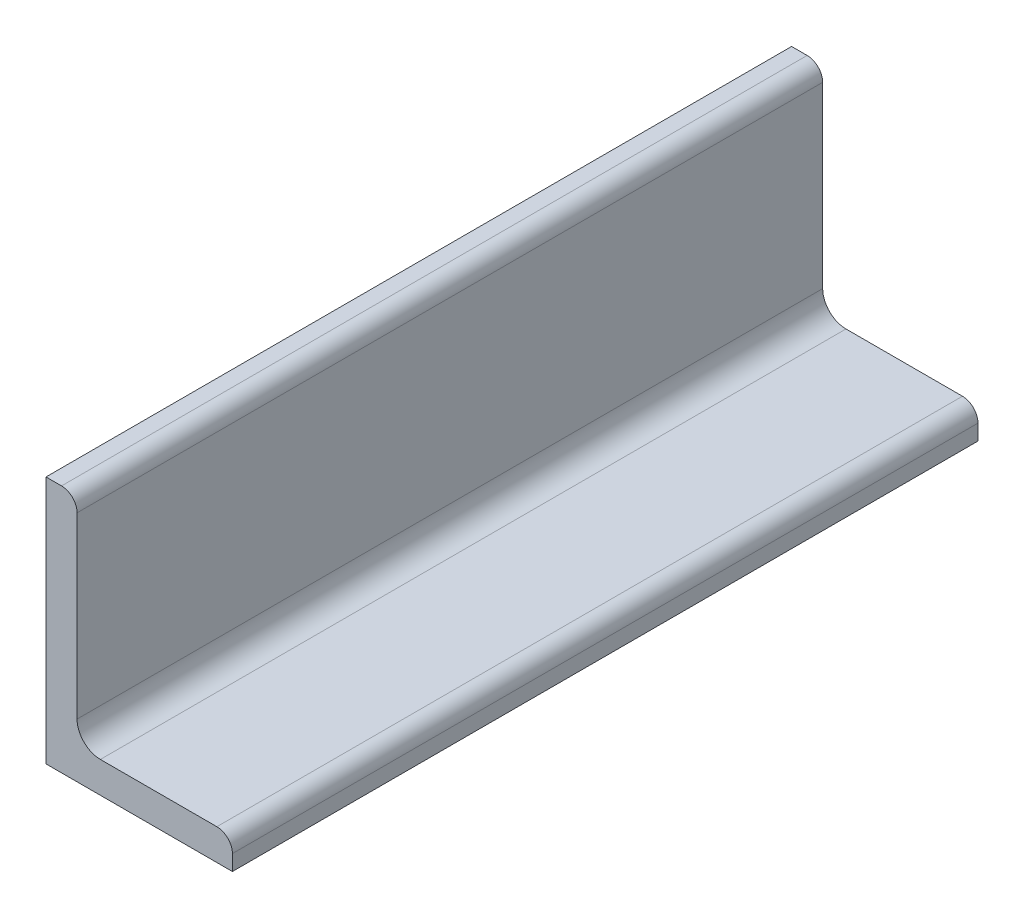
ISO-10303-21;
HEADER;
FILE_DESCRIPTION(('STEP AP214'),'2;1');
FILE_NAME('part.step','',(''),(''),'','','');
FILE_SCHEMA(('AUTOMOTIVE_DESIGN { 1 0 10303 214 1 1 1 1 }'));
ENDSEC;
DATA;
#1=APPLICATION_CONTEXT('core data for automotive mechanical design processes');
#2=APPLICATION_PROTOCOL_DEFINITION('international standard','automotive_design',2000,#1);
#3=PRODUCT_CONTEXT('',#1,'mechanical');
#4=PRODUCT('Part','Part','',(#3));
#5=PRODUCT_RELATED_PRODUCT_CATEGORY('part','',(#4));
#6=PRODUCT_DEFINITION_FORMATION('','',#4);
#7=PRODUCT_DEFINITION_CONTEXT('part definition',#1,'design');
#8=PRODUCT_DEFINITION('design','',#6,#7);
#9=PRODUCT_DEFINITION_SHAPE('','',#8);
#10=(LENGTH_UNIT() NAMED_UNIT(*) SI_UNIT(.MILLI.,.METRE.));
#11=(NAMED_UNIT(*) PLANE_ANGLE_UNIT() SI_UNIT($,.RADIAN.));
#12=(NAMED_UNIT(*) SI_UNIT($,.STERADIAN.) SOLID_ANGLE_UNIT());
#13=UNCERTAINTY_MEASURE_WITH_UNIT(LENGTH_MEASURE(1.E-05),#10,'distance_accuracy_value','');
#14=(GEOMETRIC_REPRESENTATION_CONTEXT(3) GLOBAL_UNCERTAINTY_ASSIGNED_CONTEXT((#13)) GLOBAL_UNIT_ASSIGNED_CONTEXT((#10,
#11,#12)) REPRESENTATION_CONTEXT('',''));
#15=CARTESIAN_POINT('',(0.,0.,0.));
#16=DIRECTION('',(0.,0.,1.));
#17=DIRECTION('',(1.,0.,0.));
#18=AXIS2_PLACEMENT_3D('',#15,#16,#17);
#19=CARTESIAN_POINT('',(0.490776827053332,102.172018782971,304.8));
#20=DIRECTION('',(1.,0.,0.));
#21=DIRECTION('',(0.,0.,-1.));
#22=AXIS2_PLACEMENT_3D('',#19,#20,#21);
#23=PLANE('',#22);
#24=DIRECTION('',(0.,-1.,0.));
#25=VECTOR('',#24,1.);
#26=CARTESIAN_POINT('',(0.490776827053332,102.172018782971,0.));
#27=LINE('',#26,#25);
#28=CARTESIAN_POINT('',(0.490776827053332,102.172018782971,0.));
#29=VERTEX_POINT('',#28);
#30=CARTESIAN_POINT('',(0.490776827053332,0.572018782971054,0.));
#31=VERTEX_POINT('',#30);
#32=EDGE_CURVE('E135',#29,#31,#27,.T.);
#33=ORIENTED_EDGE('',*,*,#32,.T.);
#34=DIRECTION('',(0.,0.,-1.));
#35=VECTOR('',#34,1.);
#36=CARTESIAN_POINT('',(0.490776827053332,0.572018782971054,304.8));
#37=LINE('',#36,#35);
#38=CARTESIAN_POINT('',(0.490776827053332,0.572018782971054,304.8));
#39=VERTEX_POINT('',#38);
#40=EDGE_CURVE('E11',#39,#31,#37,.T.);
#41=ORIENTED_EDGE('',*,*,#40,.F.);
#42=DIRECTION('',(0.,-1.,0.));
#43=VECTOR('',#42,1.);
#44=CARTESIAN_POINT('',(0.490776827053332,102.172018782971,304.8));
#45=LINE('',#44,#43);
#46=CARTESIAN_POINT('',(0.490776827053332,102.172018782971,304.8));
#47=VERTEX_POINT('',#46);
#48=EDGE_CURVE('E151',#47,#39,#45,.T.);
#49=ORIENTED_EDGE('',*,*,#48,.F.);
#50=DIRECTION('',(0.,0.,-1.));
#51=VECTOR('',#50,1.);
#52=CARTESIAN_POINT('',(0.490776827053332,102.172018782971,304.8));
#53=LINE('',#52,#51);
#54=EDGE_CURVE('E131',#47,#29,#53,.T.);
#55=ORIENTED_EDGE('',*,*,#54,.T.);
#56=EDGE_LOOP('',(#33,#41,#49,#55));
#57=FACE_BOUND('',#56,.T.);
#58=ADVANCED_FACE('F33',(#57),#23,.F.);
#59=CARTESIAN_POINT('',(0.490776827053332,0.572018782971054,304.8));
#60=DIRECTION('',(0.,1.,0.));
#61=DIRECTION('',(0.,0.,1.));
#62=AXIS2_PLACEMENT_3D('',#59,#60,#61);
#63=PLANE('',#62);
#64=DIRECTION('',(1.,0.,0.));
#65=VECTOR('',#64,1.);
#66=CARTESIAN_POINT('',(0.490776827053332,0.572018782971054,0.));
#67=LINE('',#66,#65);
#68=CARTESIAN_POINT('',(76.6907768270533,0.572018782971054,0.));
#69=VERTEX_POINT('',#68);
#70=EDGE_CURVE('E138',#31,#69,#67,.T.);
#71=ORIENTED_EDGE('',*,*,#70,.T.);
#72=DIRECTION('',(0.,0.,-1.));
#73=VECTOR('',#72,1.);
#74=CARTESIAN_POINT('',(76.6907768270533,0.572018782971054,304.8));
#75=LINE('',#74,#73);
#76=CARTESIAN_POINT('',(76.6907768270533,0.572018782971054,304.8));
#77=VERTEX_POINT('',#76);
#78=EDGE_CURVE('E41',#77,#69,#75,.T.);
#79=ORIENTED_EDGE('',*,*,#78,.F.);
#80=DIRECTION('',(1.,0.,0.));
#81=VECTOR('',#80,1.);
#82=CARTESIAN_POINT('',(0.490776827053332,0.572018782971054,304.8));
#83=LINE('',#82,#81);
#84=EDGE_CURVE('E95',#39,#77,#83,.T.);
#85=ORIENTED_EDGE('',*,*,#84,.F.);
#86=ORIENTED_EDGE('',*,*,#40,.T.);
#87=EDGE_LOOP('',(#71,#79,#85,#86));
#88=FACE_BOUND('',#87,.T.);
#89=ADVANCED_FACE('F194',(#88),#63,.F.);
#90=CARTESIAN_POINT('',(76.6907768270533,0.572018782971054,304.8));
#91=DIRECTION('',(-1.,0.,0.));
#92=DIRECTION('',(0.,0.,1.));
#93=AXIS2_PLACEMENT_3D('',#90,#91,#92);
#94=PLANE('',#93);
#95=DIRECTION('',(0.,1.,0.));
#96=VECTOR('',#95,1.);
#97=CARTESIAN_POINT('',(76.6907768270533,0.572018782971054,0.));
#98=LINE('',#97,#96);
#99=CARTESIAN_POINT('',(76.6907768270533,6.92201878297105,0.));
#100=VERTEX_POINT('',#99);
#101=EDGE_CURVE('E140',#69,#100,#98,.T.);
#102=ORIENTED_EDGE('',*,*,#101,.T.);
#103=DIRECTION('',(0.,0.,-1.));
#104=VECTOR('',#103,1.);
#105=CARTESIAN_POINT('',(76.6907768270533,6.92201878297105,304.8));
#106=LINE('',#105,#104);
#107=CARTESIAN_POINT('',(76.6907768270533,6.92201878297105,304.8));
#108=VERTEX_POINT('',#107);
#109=EDGE_CURVE('E161',#108,#100,#106,.T.);
#110=ORIENTED_EDGE('',*,*,#109,.F.);
#111=DIRECTION('',(0.,1.,0.));
#112=VECTOR('',#111,1.);
#113=CARTESIAN_POINT('',(76.6907768270533,0.572018782971054,304.8));
#114=LINE('',#113,#112);
#115=EDGE_CURVE('E169',#77,#108,#114,.T.);
#116=ORIENTED_EDGE('',*,*,#115,.F.);
#117=ORIENTED_EDGE('',*,*,#78,.T.);
#118=EDGE_LOOP('',(#102,#110,#116,#117));
#119=FACE_BOUND('',#118,.T.);
#120=ADVANCED_FACE('F167',(#119),#94,.F.);
#121=CARTESIAN_POINT('',(70.3407768270533,6.92201878297105,304.8));
#122=DIRECTION('',(0.,0.,-1.));
#123=DIRECTION('',(-1.,0.,0.));
#124=AXIS2_PLACEMENT_3D('',#121,#122,#123);
#125=CYLINDRICAL_SURFACE('',#124,6.35);
#126=CARTESIAN_POINT('',(70.3407768270533,6.92201878297105,0.));
#127=DIRECTION('',(0.,0.,1.));
#128=DIRECTION('',(1.,0.,0.));
#129=AXIS2_PLACEMENT_3D('',#126,#127,#128);
#130=CIRCLE('',#129,6.35);
#131=CARTESIAN_POINT('',(70.3407768270533,13.2720187829711,0.));
#132=VERTEX_POINT('',#131);
#133=EDGE_CURVE('E142',#100,#132,#130,.T.);
#134=ORIENTED_EDGE('',*,*,#133,.T.);
#135=DIRECTION('',(0.,0.,-1.));
#136=VECTOR('',#135,1.);
#137=CARTESIAN_POINT('',(70.3407768270533,13.2720187829711,304.8));
#138=LINE('',#137,#136);
#139=CARTESIAN_POINT('',(70.3407768270533,13.2720187829711,304.8));
#140=VERTEX_POINT('',#139);
#141=EDGE_CURVE('E158',#140,#132,#138,.T.);
#142=ORIENTED_EDGE('',*,*,#141,.F.);
#143=CARTESIAN_POINT('',(70.3407768270533,6.92201878297105,304.8));
#144=DIRECTION('',(0.,0.,1.));
#145=DIRECTION('',(1.,0.,0.));
#146=AXIS2_PLACEMENT_3D('',#143,#144,#145);
#147=CIRCLE('',#146,6.35);
#148=EDGE_CURVE('E185',#108,#140,#147,.T.);
#149=ORIENTED_EDGE('',*,*,#148,.F.);
#150=ORIENTED_EDGE('',*,*,#109,.T.);
#151=EDGE_LOOP('',(#134,#142,#149,#150));
#152=FACE_BOUND('',#151,.T.);
#153=ADVANCED_FACE('F178',(#152),#125,.T.);
#154=CARTESIAN_POINT('',(70.3407768270533,13.2720187829711,304.8));
#155=DIRECTION('',(0.,-1.,0.));
#156=DIRECTION('',(0.,0.,-1.));
#157=AXIS2_PLACEMENT_3D('',#154,#155,#156);
#158=PLANE('',#157);
#159=DIRECTION('',(-1.,0.,0.));
#160=VECTOR('',#159,1.);
#161=CARTESIAN_POINT('',(70.3407768270533,13.2720187829711,0.));
#162=LINE('',#161,#160);
#163=CARTESIAN_POINT('',(22.7157768270533,13.2720187829711,0.));
#164=VERTEX_POINT('',#163);
#165=EDGE_CURVE('E144',#132,#164,#162,.T.);
#166=ORIENTED_EDGE('',*,*,#165,.T.);
#167=DIRECTION('',(0.,0.,-1.));
#168=VECTOR('',#167,1.);
#169=CARTESIAN_POINT('',(22.7157768270533,13.2720187829711,304.8));
#170=LINE('',#169,#168);
#171=CARTESIAN_POINT('',(22.7157768270533,13.2720187829711,304.8));
#172=VERTEX_POINT('',#171);
#173=EDGE_CURVE('E155',#172,#164,#170,.T.);
#174=ORIENTED_EDGE('',*,*,#173,.F.);
#175=DIRECTION('',(-1.,0.,0.));
#176=VECTOR('',#175,1.);
#177=CARTESIAN_POINT('',(70.3407768270533,13.2720187829711,304.8));
#178=LINE('',#177,#176);
#179=EDGE_CURVE('E184',#140,#172,#178,.T.);
#180=ORIENTED_EDGE('',*,*,#179,.F.);
#181=ORIENTED_EDGE('',*,*,#141,.T.);
#182=EDGE_LOOP('',(#166,#174,#180,#181));
#183=FACE_BOUND('',#182,.T.);
#184=ADVANCED_FACE('F182',(#183),#158,.F.);
#185=CARTESIAN_POINT('',(22.7157768270533,22.797018782971,304.8));
#186=DIRECTION('',(0.,0.,-1.));
#187=DIRECTION('',(-1.,0.,0.));
#188=AXIS2_PLACEMENT_3D('',#185,#186,#187);
#189=CYLINDRICAL_SURFACE('',#188,9.52499999999999);
#190=CARTESIAN_POINT('',(22.7157768270533,22.797018782971,0.));
#191=DIRECTION('',(0.,0.,-1.));
#192=DIRECTION('',(1.,0.,0.));
#193=AXIS2_PLACEMENT_3D('',#190,#191,#192);
#194=CIRCLE('',#193,9.52499999999999);
#195=CARTESIAN_POINT('',(13.1907768270533,22.7970187829711,0.));
#196=VERTEX_POINT('',#195);
#197=EDGE_CURVE('E146',#164,#196,#194,.T.);
#198=ORIENTED_EDGE('',*,*,#197,.T.);
#199=DIRECTION('',(0.,0.,-1.));
#200=VECTOR('',#199,1.);
#201=CARTESIAN_POINT('',(13.1907768270533,22.7970187829711,304.8));
#202=LINE('',#201,#200);
#203=CARTESIAN_POINT('',(13.1907768270533,22.7970187829711,304.8));
#204=VERTEX_POINT('',#203);
#205=EDGE_CURVE('E126',#204,#196,#202,.T.);
#206=ORIENTED_EDGE('',*,*,#205,.F.);
#207=CARTESIAN_POINT('',(22.7157768270533,22.797018782971,304.8));
#208=DIRECTION('',(0.,0.,-1.));
#209=DIRECTION('',(1.,0.,0.));
#210=AXIS2_PLACEMENT_3D('',#207,#208,#209);
#211=CIRCLE('',#210,9.52499999999999);
#212=EDGE_CURVE('E117',#172,#204,#211,.T.);
#213=ORIENTED_EDGE('',*,*,#212,.F.);
#214=ORIENTED_EDGE('',*,*,#173,.T.);
#215=EDGE_LOOP('',(#198,#206,#213,#214));
#216=FACE_BOUND('',#215,.T.);
#217=ADVANCED_FACE('F206',(#216),#189,.F.);
#218=CARTESIAN_POINT('',(13.1907768270533,22.7970187829711,304.8));
#219=DIRECTION('',(-1.,0.,0.));
#220=DIRECTION('',(0.,0.,1.));
#221=AXIS2_PLACEMENT_3D('',#218,#219,#220);
#222=PLANE('',#221);
#223=DIRECTION('',(0.,1.,0.));
#224=VECTOR('',#223,1.);
#225=CARTESIAN_POINT('',(13.1907768270533,22.7970187829711,0.));
#226=LINE('',#225,#224);
#227=CARTESIAN_POINT('',(13.1907768270533,95.822018782971,0.));
#228=VERTEX_POINT('',#227);
#229=EDGE_CURVE('E125',#196,#228,#226,.T.);
#230=ORIENTED_EDGE('',*,*,#229,.T.);
#231=DIRECTION('',(0.,0.,-1.));
#232=VECTOR('',#231,1.);
#233=CARTESIAN_POINT('',(13.1907768270533,95.822018782971,304.8));
#234=LINE('',#233,#232);
#235=CARTESIAN_POINT('',(13.1907768270533,95.822018782971,304.8));
#236=VERTEX_POINT('',#235);
#237=EDGE_CURVE('E122',#236,#228,#234,.T.);
#238=ORIENTED_EDGE('',*,*,#237,.F.);
#239=DIRECTION('',(0.,1.,0.));
#240=VECTOR('',#239,1.);
#241=CARTESIAN_POINT('',(13.1907768270533,22.7970187829711,304.8));
#242=LINE('',#241,#240);
#243=EDGE_CURVE('E111',#204,#236,#242,.T.);
#244=ORIENTED_EDGE('',*,*,#243,.F.);
#245=ORIENTED_EDGE('',*,*,#205,.T.);
#246=EDGE_LOOP('',(#230,#238,#244,#245));
#247=FACE_BOUND('',#246,.T.);
#248=ADVANCED_FACE('F123',(#247),#222,.F.);
#249=CARTESIAN_POINT('',(6.84077682705333,95.822018782971,304.8));
#250=DIRECTION('',(0.,0.,-1.));
#251=DIRECTION('',(-1.,0.,0.));
#252=AXIS2_PLACEMENT_3D('',#249,#250,#251);
#253=CYLINDRICAL_SURFACE('',#252,6.35);
#254=CARTESIAN_POINT('',(6.84077682705333,95.822018782971,0.));
#255=DIRECTION('',(0.,0.,1.));
#256=DIRECTION('',(1.,0.,0.));
#257=AXIS2_PLACEMENT_3D('',#254,#255,#256);
#258=CIRCLE('',#257,6.35);
#259=CARTESIAN_POINT('',(6.84077682705333,102.172018782971,0.));
#260=VERTEX_POINT('',#259);
#261=EDGE_CURVE('E81',#228,#260,#258,.T.);
#262=ORIENTED_EDGE('',*,*,#261,.T.);
#263=DIRECTION('',(0.,0.,-1.));
#264=VECTOR('',#263,1.);
#265=CARTESIAN_POINT('',(6.84077682705333,102.172018782971,304.8));
#266=LINE('',#265,#264);
#267=CARTESIAN_POINT('',(6.84077682705333,102.172018782971,304.8));
#268=VERTEX_POINT('',#267);
#269=EDGE_CURVE('E127',#268,#260,#266,.T.);
#270=ORIENTED_EDGE('',*,*,#269,.F.);
#271=CARTESIAN_POINT('',(6.84077682705333,95.822018782971,304.8));
#272=DIRECTION('',(0.,0.,1.));
#273=DIRECTION('',(1.,0.,0.));
#274=AXIS2_PLACEMENT_3D('',#271,#272,#273);
#275=CIRCLE('',#274,6.35);
#276=EDGE_CURVE('E115',#236,#268,#275,.T.);
#277=ORIENTED_EDGE('',*,*,#276,.F.);
#278=ORIENTED_EDGE('',*,*,#237,.T.);
#279=EDGE_LOOP('',(#262,#270,#277,#278));
#280=FACE_BOUND('',#279,.T.);
#281=ADVANCED_FACE('F129',(#280),#253,.T.);
#282=CARTESIAN_POINT('',(6.84077682705333,102.172018782971,304.8));
#283=DIRECTION('',(0.,-1.,0.));
#284=DIRECTION('',(0.,0.,-1.));
#285=AXIS2_PLACEMENT_3D('',#282,#283,#284);
#286=PLANE('',#285);
#287=DIRECTION('',(-1.,0.,0.));
#288=VECTOR('',#287,1.);
#289=CARTESIAN_POINT('',(6.84077682705333,102.172018782971,0.));
#290=LINE('',#289,#288);
#291=EDGE_CURVE('E87',#260,#29,#290,.T.);
#292=ORIENTED_EDGE('',*,*,#291,.T.);
#293=ORIENTED_EDGE('',*,*,#54,.F.);
#294=DIRECTION('',(-1.,0.,0.));
#295=VECTOR('',#294,1.);
#296=CARTESIAN_POINT('',(6.84077682705333,102.172018782971,304.8));
#297=LINE('',#296,#295);
#298=EDGE_CURVE('E49',#268,#47,#297,.T.);
#299=ORIENTED_EDGE('',*,*,#298,.F.);
#300=ORIENTED_EDGE('',*,*,#269,.T.);
#301=EDGE_LOOP('',(#292,#293,#299,#300));
#302=FACE_BOUND('',#301,.T.);
#303=ADVANCED_FACE('F214',(#302),#286,.F.);
#304=CARTESIAN_POINT('',(70.3407768270533,6.92201878297105,304.8));
#305=DIRECTION('',(0.,0.,1.));
#306=DIRECTION('',(1.,0.,0.));
#307=AXIS2_PLACEMENT_3D('',#304,#305,#306);
#308=PLANE('',#307);
#309=ORIENTED_EDGE('',*,*,#48,.T.);
#310=ORIENTED_EDGE('',*,*,#84,.T.);
#311=ORIENTED_EDGE('',*,*,#115,.T.);
#312=ORIENTED_EDGE('',*,*,#148,.T.);
#313=ORIENTED_EDGE('',*,*,#179,.T.);
#314=ORIENTED_EDGE('',*,*,#212,.T.);
#315=ORIENTED_EDGE('',*,*,#243,.T.);
#316=ORIENTED_EDGE('',*,*,#276,.T.);
#317=ORIENTED_EDGE('',*,*,#298,.T.);
#318=EDGE_LOOP('',(#309,#310,#311,#312,#313,#314,#315,#316,#317));
#319=FACE_BOUND('',#318,.T.);
#320=ADVANCED_FACE('F113',(#319),#308,.T.);
#321=CARTESIAN_POINT('',(70.3407768270533,6.92201878297105,0.));
#322=DIRECTION('',(0.,0.,1.));
#323=DIRECTION('',(1.,0.,0.));
#324=AXIS2_PLACEMENT_3D('',#321,#322,#323);
#325=PLANE('',#324);
#326=ORIENTED_EDGE('',*,*,#32,.F.);
#327=ORIENTED_EDGE('',*,*,#291,.F.);
#328=ORIENTED_EDGE('',*,*,#261,.F.);
#329=ORIENTED_EDGE('',*,*,#229,.F.);
#330=ORIENTED_EDGE('',*,*,#197,.F.);
#331=ORIENTED_EDGE('',*,*,#165,.F.);
#332=ORIENTED_EDGE('',*,*,#133,.F.);
#333=ORIENTED_EDGE('',*,*,#101,.F.);
#334=ORIENTED_EDGE('',*,*,#70,.F.);
#335=EDGE_LOOP('',(#326,#327,#328,#329,#330,#331,#332,#333,#334));
#336=FACE_BOUND('',#335,.T.);
#337=ADVANCED_FACE('F173',(#336),#325,.F.);
#338=CLOSED_SHELL('',(#58,#89,#120,#153,#184,#217,#248,#281,#303,#320,#337));
#339=MANIFOLD_SOLID_BREP('B2',#338);
#340=ADVANCED_BREP_SHAPE_REPRESENTATION('',(#18,#339),#14);
#341=SHAPE_DEFINITION_REPRESENTATION(#9,#340);
ENDSEC;
END-ISO-10303-21;
